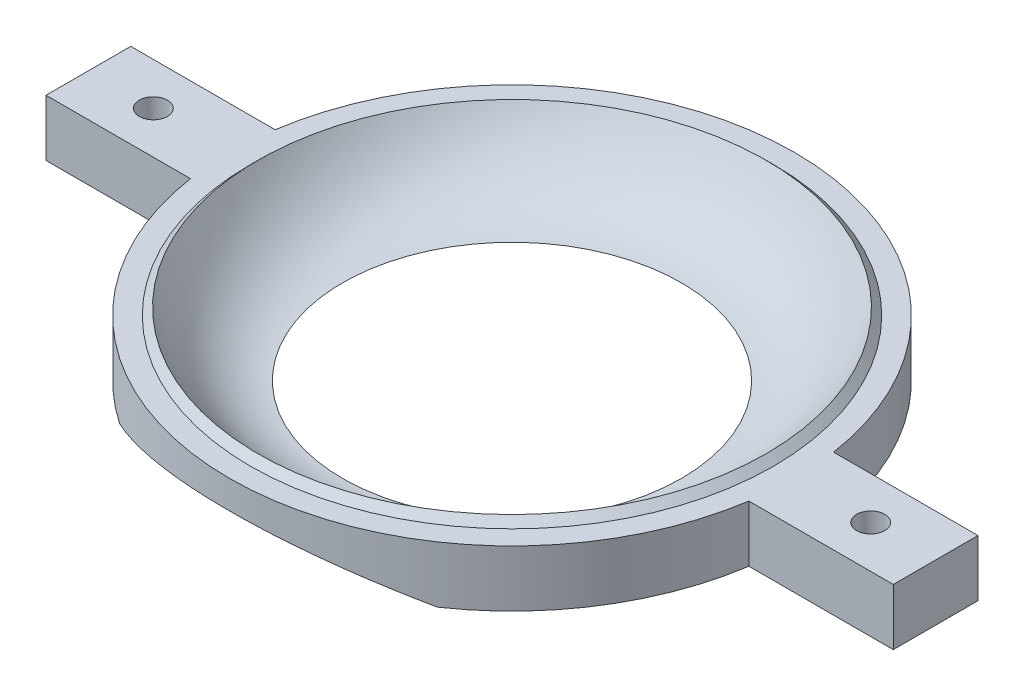
ISO-10303-21;
HEADER;
FILE_DESCRIPTION(('STEP AP214'),'2;1');
FILE_NAME('part.step','',(''),(''),'','','');
FILE_SCHEMA(('AUTOMOTIVE_DESIGN { 1 0 10303 214 1 1 1 1 }'));
ENDSEC;
DATA;
#1=APPLICATION_CONTEXT('core data for automotive mechanical design processes');
#2=APPLICATION_PROTOCOL_DEFINITION('international standard','automotive_design',2000,#1);
#3=PRODUCT_CONTEXT('',#1,'mechanical');
#4=PRODUCT('Part','Part','',(#3));
#5=PRODUCT_RELATED_PRODUCT_CATEGORY('part','',(#4));
#6=PRODUCT_DEFINITION_FORMATION('','',#4);
#7=PRODUCT_DEFINITION_CONTEXT('part definition',#1,'design');
#8=PRODUCT_DEFINITION('design','',#6,#7);
#9=PRODUCT_DEFINITION_SHAPE('','',#8);
#10=(LENGTH_UNIT() NAMED_UNIT(*) SI_UNIT(.MILLI.,.METRE.));
#11=(NAMED_UNIT(*) PLANE_ANGLE_UNIT() SI_UNIT($,.RADIAN.));
#12=(NAMED_UNIT(*) SI_UNIT($,.STERADIAN.) SOLID_ANGLE_UNIT());
#13=UNCERTAINTY_MEASURE_WITH_UNIT(LENGTH_MEASURE(1.E-05),#10,'distance_accuracy_value','');
#14=(GEOMETRIC_REPRESENTATION_CONTEXT(3) GLOBAL_UNCERTAINTY_ASSIGNED_CONTEXT((#13)) GLOBAL_UNIT_ASSIGNED_CONTEXT((#10,
#11,#12)) REPRESENTATION_CONTEXT('',''));
#15=CARTESIAN_POINT('',(0.,0.,0.));
#16=DIRECTION('',(0.,0.,1.));
#17=DIRECTION('',(1.,0.,0.));
#18=AXIS2_PLACEMENT_3D('',#15,#16,#17);
#19=CARTESIAN_POINT('',(0.,1.,0.));
#20=DIRECTION('',(0.,-1.,0.));
#21=DIRECTION('',(0.,0.,-1.));
#22=AXIS2_PLACEMENT_3D('',#19,#20,#21);
#23=CYLINDRICAL_SURFACE('',#22,10.);
#24=CARTESIAN_POINT('',(0.,-1.,0.));
#25=DIRECTION('',(0.,1.,0.));
#26=DIRECTION('',(0.,0.,1.));
#27=AXIS2_PLACEMENT_3D('',#24,#25,#26);
#28=CIRCLE('',#27,10.);
#29=CARTESIAN_POINT('',(-9.88685996664258,-1.,1.50000000000011));
#30=VERTEX_POINT('',#29);
#31=CARTESIAN_POINT('',(-5.62503476890386,-1.,8.26794919243114));
#32=VERTEX_POINT('',#31);
#33=EDGE_CURVE('E118',#30,#32,#28,.T.);
#34=ORIENTED_EDGE('',*,*,#33,.T.);
#35=CARTESIAN_POINT('',(0.,-5.7735026918963,0.));
#36=DIRECTION('',(0.,0.866025403784437,-0.500000000000003));
#37=DIRECTION('',(0.,-0.500000000000003,-0.866025403784437));
#38=AXIS2_PLACEMENT_3D('',#35,#36,#37);
#39=ELLIPSE('',#38,11.5470053837925,10.);
#40=CARTESIAN_POINT('',(5.62503476890386,-1.,8.26794919243114));
#41=VERTEX_POINT('',#40);
#42=EDGE_CURVE('E57',#32,#41,#39,.T.);
#43=ORIENTED_EDGE('',*,*,#42,.T.);
#44=CARTESIAN_POINT('',(9.88685996664258,-1.,1.50000000000011));
#45=VERTEX_POINT('',#44);
#46=EDGE_CURVE('E114',#41,#45,#28,.T.);
#47=ORIENTED_EDGE('',*,*,#46,.T.);
#48=DIRECTION('',(0.,-1.,0.));
#49=VECTOR('',#48,1.);
#50=CARTESIAN_POINT('',(9.88685996664258,1.,1.50000000000011));
#51=LINE('',#50,#49);
#52=CARTESIAN_POINT('',(9.88685996664258,1.,1.50000000000011));
#53=VERTEX_POINT('',#52);
#54=EDGE_CURVE('E122',#53,#45,#51,.T.);
#55=ORIENTED_EDGE('',*,*,#54,.F.);
#56=CARTESIAN_POINT('',(0.,1.,0.));
#57=DIRECTION('',(0.,1.,0.));
#58=DIRECTION('',(0.,0.,1.));
#59=AXIS2_PLACEMENT_3D('',#56,#57,#58);
#60=CIRCLE('',#59,10.);
#61=CARTESIAN_POINT('',(-9.88685996664258,1.,1.50000000000011));
#62=VERTEX_POINT('',#61);
#63=EDGE_CURVE('E163',#62,#53,#60,.T.);
#64=ORIENTED_EDGE('',*,*,#63,.F.);
#65=DIRECTION('',(0.,-1.,0.));
#66=VECTOR('',#65,1.);
#67=CARTESIAN_POINT('',(-9.88685996664258,1.,1.50000000000011));
#68=LINE('',#67,#66);
#69=EDGE_CURVE('E164',#62,#30,#68,.T.);
#70=ORIENTED_EDGE('',*,*,#69,.T.);
#71=EDGE_LOOP('',(#34,#43,#47,#55,#64,#70));
#72=FACE_BOUND('',#71,.T.);
#73=ADVANCED_FACE('F38',(#72),#23,.T.);
#74=CARTESIAN_POINT('',(0.,1.,1.50000000000011));
#75=DIRECTION('',(0.,0.,-1.));
#76=DIRECTION('',(-1.,0.,0.));
#77=AXIS2_PLACEMENT_3D('',#74,#75,#76);
#78=PLANE('',#77);
#79=DIRECTION('',(1.,0.,0.));
#80=VECTOR('',#79,1.);
#81=CARTESIAN_POINT('',(0.,-1.,1.50000000000011));
#82=LINE('',#81,#80);
#83=CARTESIAN_POINT('',(14.9999999999999,-1.,1.50000000000011));
#84=VERTEX_POINT('',#83);
#85=EDGE_CURVE('E127',#45,#84,#82,.T.);
#86=ORIENTED_EDGE('',*,*,#85,.T.);
#87=DIRECTION('',(0.,-1.,0.));
#88=VECTOR('',#87,1.);
#89=CARTESIAN_POINT('',(14.9999999999999,1.,1.50000000000011));
#90=LINE('',#89,#88);
#91=CARTESIAN_POINT('',(14.9999999999999,1.,1.50000000000011));
#92=VERTEX_POINT('',#91);
#93=EDGE_CURVE('E177',#92,#84,#90,.T.);
#94=ORIENTED_EDGE('',*,*,#93,.F.);
#95=DIRECTION('',(1.,0.,0.));
#96=VECTOR('',#95,1.);
#97=CARTESIAN_POINT('',(0.,1.,1.50000000000011));
#98=LINE('',#97,#96);
#99=EDGE_CURVE('E183',#53,#92,#98,.T.);
#100=ORIENTED_EDGE('',*,*,#99,.F.);
#101=ORIENTED_EDGE('',*,*,#54,.T.);
#102=EDGE_LOOP('',(#86,#94,#100,#101));
#103=FACE_BOUND('',#102,.T.);
#104=ADVANCED_FACE('F181',(#103),#78,.F.);
#105=CARTESIAN_POINT('',(15.,1.,3.2959746043558E-13));
#106=DIRECTION('',(-1.,0.,0.));
#107=DIRECTION('',(0.,0.,1.));
#108=AXIS2_PLACEMENT_3D('',#105,#106,#107);
#109=PLANE('',#108);
#110=DIRECTION('',(0.,0.,-1.));
#111=VECTOR('',#110,1.);
#112=CARTESIAN_POINT('',(15.,-1.,3.2959746043558E-13));
#113=LINE('',#112,#111);
#114=CARTESIAN_POINT('',(15.,-1.,-1.5));
#115=VERTEX_POINT('',#114);
#116=EDGE_CURVE('E139',#84,#115,#113,.T.);
#117=ORIENTED_EDGE('',*,*,#116,.T.);
#118=DIRECTION('',(0.,-1.,0.));
#119=VECTOR('',#118,1.);
#120=CARTESIAN_POINT('',(15.,1.,-1.5));
#121=LINE('',#120,#119);
#122=CARTESIAN_POINT('',(15.,1.,-1.5));
#123=VERTEX_POINT('',#122);
#124=EDGE_CURVE('E175',#123,#115,#121,.T.);
#125=ORIENTED_EDGE('',*,*,#124,.F.);
#126=DIRECTION('',(0.,0.,-1.));
#127=VECTOR('',#126,1.);
#128=CARTESIAN_POINT('',(15.,1.,3.2959746043558E-13));
#129=LINE('',#128,#127);
#130=EDGE_CURVE('E189',#92,#123,#129,.T.);
#131=ORIENTED_EDGE('',*,*,#130,.F.);
#132=ORIENTED_EDGE('',*,*,#93,.T.);
#133=EDGE_LOOP('',(#117,#125,#131,#132));
#134=FACE_BOUND('',#133,.T.);
#135=ADVANCED_FACE('F270',(#134),#109,.F.);
#136=CARTESIAN_POINT('',(0.,1.,-1.5));
#137=DIRECTION('',(0.,0.,-1.));
#138=DIRECTION('',(-1.,0.,0.));
#139=AXIS2_PLACEMENT_3D('',#136,#137,#138);
#140=PLANE('',#139);
#141=DIRECTION('',(1.,0.,0.));
#142=VECTOR('',#141,1.);
#143=CARTESIAN_POINT('',(0.,-1.,-1.5));
#144=LINE('',#143,#142);
#145=CARTESIAN_POINT('',(9.88685996664259,-1.,-1.5));
#146=VERTEX_POINT('',#145);
#147=EDGE_CURVE('E142',#146,#115,#144,.T.);
#148=ORIENTED_EDGE('',*,*,#147,.F.);
#149=DIRECTION('',(0.,-1.,0.));
#150=VECTOR('',#149,1.);
#151=CARTESIAN_POINT('',(9.88685996664259,1.,-1.5));
#152=LINE('',#151,#150);
#153=CARTESIAN_POINT('',(9.88685996664259,1.,-1.5));
#154=VERTEX_POINT('',#153);
#155=EDGE_CURVE('E173',#154,#146,#152,.T.);
#156=ORIENTED_EDGE('',*,*,#155,.F.);
#157=DIRECTION('',(1.,0.,0.));
#158=VECTOR('',#157,1.);
#159=CARTESIAN_POINT('',(0.,1.,-1.5));
#160=LINE('',#159,#158);
#161=EDGE_CURVE('E194',#154,#123,#160,.T.);
#162=ORIENTED_EDGE('',*,*,#161,.T.);
#163=ORIENTED_EDGE('',*,*,#124,.T.);
#164=EDGE_LOOP('',(#148,#156,#162,#163));
#165=FACE_BOUND('',#164,.T.);
#166=ADVANCED_FACE('F266',(#165),#140,.T.);
#167=CARTESIAN_POINT('',(0.,1.,0.));
#168=DIRECTION('',(0.,-1.,0.));
#169=DIRECTION('',(0.,0.,-1.));
#170=AXIS2_PLACEMENT_3D('',#167,#168,#169);
#171=CYLINDRICAL_SURFACE('',#170,10.);
#172=CARTESIAN_POINT('',(0.,-1.,0.));
#173=DIRECTION('',(0.,1.,0.));
#174=DIRECTION('',(0.,0.,1.));
#175=AXIS2_PLACEMENT_3D('',#172,#173,#174);
#176=CIRCLE('',#175,10.);
#177=CARTESIAN_POINT('',(5.62503476890386,-1.,-8.26794919243114));
#178=VERTEX_POINT('',#177);
#179=EDGE_CURVE('E146',#146,#178,#176,.T.);
#180=ORIENTED_EDGE('',*,*,#179,.T.);
#181=CARTESIAN_POINT('',(0.,-5.77350269189632,0.));
#182=DIRECTION('',(0.,0.866025403784436,0.500000000000004));
#183=DIRECTION('',(0.,-0.500000000000004,0.866025403784436));
#184=AXIS2_PLACEMENT_3D('',#181,#182,#183);
#185=ELLIPSE('',#184,11.5470053837925,10.);
#186=CARTESIAN_POINT('',(-5.62503476890385,-0.999999999999998,-8.26794919243114));
#187=VERTEX_POINT('',#186);
#188=EDGE_CURVE('E51',#178,#187,#185,.T.);
#189=ORIENTED_EDGE('',*,*,#188,.T.);
#190=CARTESIAN_POINT('',(-9.88685996664259,-1.,-1.5));
#191=VERTEX_POINT('',#190);
#192=EDGE_CURVE('E145',#187,#191,#176,.T.);
#193=ORIENTED_EDGE('',*,*,#192,.T.);
#194=DIRECTION('',(0.,-1.,0.));
#195=VECTOR('',#194,1.);
#196=CARTESIAN_POINT('',(-9.88685996664259,1.,-1.5));
#197=LINE('',#196,#195);
#198=CARTESIAN_POINT('',(-9.88685996664259,1.,-1.5));
#199=VERTEX_POINT('',#198);
#200=EDGE_CURVE('E170',#199,#191,#197,.T.);
#201=ORIENTED_EDGE('',*,*,#200,.F.);
#202=CARTESIAN_POINT('',(0.,1.,0.));
#203=DIRECTION('',(0.,1.,0.));
#204=DIRECTION('',(0.,0.,1.));
#205=AXIS2_PLACEMENT_3D('',#202,#203,#204);
#206=CIRCLE('',#205,10.);
#207=EDGE_CURVE('E197',#154,#199,#206,.T.);
#208=ORIENTED_EDGE('',*,*,#207,.F.);
#209=ORIENTED_EDGE('',*,*,#155,.T.);
#210=EDGE_LOOP('',(#180,#189,#193,#201,#208,#209));
#211=FACE_BOUND('',#210,.T.);
#212=ADVANCED_FACE('F262',(#211),#171,.T.);
#213=CARTESIAN_POINT('',(0.,1.,-1.5));
#214=DIRECTION('',(0.,0.,-1.));
#215=DIRECTION('',(-1.,0.,0.));
#216=AXIS2_PLACEMENT_3D('',#213,#214,#215);
#217=PLANE('',#216);
#218=DIRECTION('',(1.,0.,0.));
#219=VECTOR('',#218,1.);
#220=CARTESIAN_POINT('',(0.,-1.,-1.5));
#221=LINE('',#220,#219);
#222=CARTESIAN_POINT('',(-15.,-1.,-1.5));
#223=VERTEX_POINT('',#222);
#224=EDGE_CURVE('E149',#223,#191,#221,.T.);
#225=ORIENTED_EDGE('',*,*,#224,.F.);
#226=DIRECTION('',(0.,-1.,0.));
#227=VECTOR('',#226,1.);
#228=CARTESIAN_POINT('',(-15.,1.,-1.5));
#229=LINE('',#228,#227);
#230=CARTESIAN_POINT('',(-15.,1.,-1.5));
#231=VERTEX_POINT('',#230);
#232=EDGE_CURVE('E168',#231,#223,#229,.T.);
#233=ORIENTED_EDGE('',*,*,#232,.F.);
#234=DIRECTION('',(1.,0.,0.));
#235=VECTOR('',#234,1.);
#236=CARTESIAN_POINT('',(0.,1.,-1.5));
#237=LINE('',#236,#235);
#238=EDGE_CURVE('E199',#231,#199,#237,.T.);
#239=ORIENTED_EDGE('',*,*,#238,.T.);
#240=ORIENTED_EDGE('',*,*,#200,.T.);
#241=EDGE_LOOP('',(#225,#233,#239,#240));
#242=FACE_BOUND('',#241,.T.);
#243=ADVANCED_FACE('F258',(#242),#217,.T.);
#244=CARTESIAN_POINT('',(-15.,1.,3.2959746043558E-13));
#245=DIRECTION('',(-1.,0.,0.));
#246=DIRECTION('',(0.,0.,1.));
#247=AXIS2_PLACEMENT_3D('',#244,#245,#246);
#248=PLANE('',#247);
#249=DIRECTION('',(0.,0.,-1.));
#250=VECTOR('',#249,1.);
#251=CARTESIAN_POINT('',(-15.,-1.,3.2959746043558E-13));
#252=LINE('',#251,#250);
#253=CARTESIAN_POINT('',(-14.9999999999999,-1.,1.50000000000011));
#254=VERTEX_POINT('',#253);
#255=EDGE_CURVE('E152',#254,#223,#252,.T.);
#256=ORIENTED_EDGE('',*,*,#255,.F.);
#257=DIRECTION('',(0.,-1.,0.));
#258=VECTOR('',#257,1.);
#259=CARTESIAN_POINT('',(-14.9999999999999,1.,1.50000000000011));
#260=LINE('',#259,#258);
#261=CARTESIAN_POINT('',(-14.9999999999999,1.,1.50000000000011));
#262=VERTEX_POINT('',#261);
#263=EDGE_CURVE('E166',#262,#254,#260,.T.);
#264=ORIENTED_EDGE('',*,*,#263,.F.);
#265=DIRECTION('',(0.,0.,-1.));
#266=VECTOR('',#265,1.);
#267=CARTESIAN_POINT('',(-15.,1.,3.2959746043558E-13));
#268=LINE('',#267,#266);
#269=EDGE_CURVE('E202',#262,#231,#268,.T.);
#270=ORIENTED_EDGE('',*,*,#269,.T.);
#271=ORIENTED_EDGE('',*,*,#232,.T.);
#272=EDGE_LOOP('',(#256,#264,#270,#271));
#273=FACE_BOUND('',#272,.T.);
#274=ADVANCED_FACE('F252',(#273),#248,.T.);
#275=CARTESIAN_POINT('',(-12.7,1.,0.));
#276=DIRECTION('',(0.,-1.,0.));
#277=DIRECTION('',(0.,0.,-1.));
#278=AXIS2_PLACEMENT_3D('',#275,#276,#277);
#279=CYLINDRICAL_SURFACE('',#278,0.500000000000001);
#280=CARTESIAN_POINT('',(-12.7,1.,0.));
#281=DIRECTION('',(0.,1.,0.));
#282=DIRECTION('',(0.,0.,1.));
#283=AXIS2_PLACEMENT_3D('',#280,#281,#282);
#284=CIRCLE('',#283,0.500000000000001);
#285=CARTESIAN_POINT('',(-12.7,1.,0.500000000000001));
#286=VERTEX_POINT('',#285);
#287=EDGE_CURVE('E206',#286,#286,#284,.T.);
#288=ORIENTED_EDGE('',*,*,#287,.T.);
#289=EDGE_LOOP('',(#288));
#290=FACE_BOUND('',#289,.T.);
#291=CARTESIAN_POINT('',(-12.7,-1.,0.));
#292=DIRECTION('',(0.,1.,0.));
#293=DIRECTION('',(0.,0.,1.));
#294=AXIS2_PLACEMENT_3D('',#291,#292,#293);
#295=CIRCLE('',#294,0.500000000000001);
#296=CARTESIAN_POINT('',(-12.7,-1.,0.500000000000001));
#297=VERTEX_POINT('',#296);
#298=EDGE_CURVE('E157',#297,#297,#295,.T.);
#299=ORIENTED_EDGE('',*,*,#298,.F.);
#300=EDGE_LOOP('',(#299));
#301=FACE_BOUND('',#300,.T.);
#302=ADVANCED_FACE('F249',(#290,#301),#279,.F.);
#303=CARTESIAN_POINT('',(0.,1.,1.50000000000011));
#304=DIRECTION('',(0.,0.,-1.));
#305=DIRECTION('',(-1.,0.,0.));
#306=AXIS2_PLACEMENT_3D('',#303,#304,#305);
#307=PLANE('',#306);
#308=DIRECTION('',(1.,0.,0.));
#309=VECTOR('',#308,1.);
#310=CARTESIAN_POINT('',(0.,-1.,1.50000000000011));
#311=LINE('',#310,#309);
#312=EDGE_CURVE('E155',#254,#30,#311,.T.);
#313=ORIENTED_EDGE('',*,*,#312,.T.);
#314=ORIENTED_EDGE('',*,*,#69,.F.);
#315=DIRECTION('',(1.,0.,0.));
#316=VECTOR('',#315,1.);
#317=CARTESIAN_POINT('',(0.,1.,1.50000000000011));
#318=LINE('',#317,#316);
#319=EDGE_CURVE('E205',#262,#62,#318,.T.);
#320=ORIENTED_EDGE('',*,*,#319,.F.);
#321=ORIENTED_EDGE('',*,*,#263,.T.);
#322=EDGE_LOOP('',(#313,#314,#320,#321));
#323=FACE_BOUND('',#322,.T.);
#324=ADVANCED_FACE('F218',(#323),#307,.F.);
#325=CARTESIAN_POINT('',(12.7,1.,0.));
#326=DIRECTION('',(0.,-1.,0.));
#327=DIRECTION('',(0.,0.,-1.));
#328=AXIS2_PLACEMENT_3D('',#325,#326,#327);
#329=CYLINDRICAL_SURFACE('',#328,0.500000000000001);
#330=CARTESIAN_POINT('',(12.7,1.,0.));
#331=DIRECTION('',(0.,1.,0.));
#332=DIRECTION('',(0.,0.,1.));
#333=AXIS2_PLACEMENT_3D('',#330,#331,#332);
#334=CIRCLE('',#333,0.500000000000001);
#335=CARTESIAN_POINT('',(12.7,1.,0.500000000000001));
#336=VERTEX_POINT('',#335);
#337=EDGE_CURVE('E136',#336,#336,#334,.F.);
#338=ORIENTED_EDGE('',*,*,#337,.F.);
#339=EDGE_LOOP('',(#338));
#340=FACE_BOUND('',#339,.T.);
#341=CARTESIAN_POINT('',(12.7,-1.,0.));
#342=DIRECTION('',(0.,1.,0.));
#343=DIRECTION('',(0.,0.,1.));
#344=AXIS2_PLACEMENT_3D('',#341,#342,#343);
#345=CIRCLE('',#344,0.500000000000001);
#346=CARTESIAN_POINT('',(12.7,-1.,0.500000000000001));
#347=VERTEX_POINT('',#346);
#348=EDGE_CURVE('E160',#347,#347,#345,.F.);
#349=ORIENTED_EDGE('',*,*,#348,.T.);
#350=EDGE_LOOP('',(#349));
#351=FACE_BOUND('',#350,.T.);
#352=ADVANCED_FACE('F215',(#340,#351),#329,.F.);
#353=CARTESIAN_POINT('',(0.,1.,0.));
#354=DIRECTION('',(0.,1.,0.));
#355=DIRECTION('',(0.,0.,1.));
#356=AXIS2_PLACEMENT_3D('',#353,#354,#355);
#357=PLANE('',#356);
#358=CARTESIAN_POINT('',(0.,1.00000000000011,0.));
#359=DIRECTION('',(0.,-1.,0.));
#360=DIRECTION('',(1.,0.,0.));
#361=AXIS2_PLACEMENT_3D('',#358,#359,#360);
#362=CIRCLE('',#361,9.25684970824005);
#363=CARTESIAN_POINT('',(9.25684970824004,1.00000000000014,0.));
#364=VERTEX_POINT('',#363);
#365=EDGE_CURVE('E132',#364,#364,#362,.T.);
#366=ORIENTED_EDGE('',*,*,#365,.T.);
#367=EDGE_LOOP('',(#366));
#368=FACE_BOUND('',#367,.T.);
#369=ORIENTED_EDGE('',*,*,#63,.T.);
#370=ORIENTED_EDGE('',*,*,#99,.T.);
#371=ORIENTED_EDGE('',*,*,#130,.T.);
#372=ORIENTED_EDGE('',*,*,#161,.F.);
#373=ORIENTED_EDGE('',*,*,#207,.T.);
#374=ORIENTED_EDGE('',*,*,#238,.F.);
#375=ORIENTED_EDGE('',*,*,#269,.F.);
#376=ORIENTED_EDGE('',*,*,#319,.T.);
#377=EDGE_LOOP('',(#369,#370,#371,#372,#373,#374,#375,#376));
#378=FACE_BOUND('',#377,.T.);
#379=ORIENTED_EDGE('',*,*,#287,.F.);
#380=EDGE_LOOP('',(#379));
#381=FACE_BOUND('',#380,.T.);
#382=ORIENTED_EDGE('',*,*,#337,.T.);
#383=EDGE_LOOP('',(#382));
#384=FACE_BOUND('',#383,.T.);
#385=ADVANCED_FACE('F213',(#368,#378,#381,#384),#357,.T.);
#386=CARTESIAN_POINT('',(0.,-1.,0.));
#387=DIRECTION('',(0.,1.,0.));
#388=DIRECTION('',(0.,0.,1.));
#389=AXIS2_PLACEMENT_3D('',#386,#387,#388);
#390=PLANE('',#389);
#391=ORIENTED_EDGE('',*,*,#192,.F.);
#392=DIRECTION('',(1.,0.,0.));
#393=VECTOR('',#392,1.);
#394=CARTESIAN_POINT('',(0.,-1.,-8.26794919243114));
#395=LINE('',#394,#393);
#396=EDGE_CURVE('E11',#187,#178,#395,.T.);
#397=ORIENTED_EDGE('',*,*,#396,.T.);
#398=ORIENTED_EDGE('',*,*,#179,.F.);
#399=ORIENTED_EDGE('',*,*,#147,.T.);
#400=ORIENTED_EDGE('',*,*,#116,.F.);
#401=ORIENTED_EDGE('',*,*,#85,.F.);
#402=ORIENTED_EDGE('',*,*,#46,.F.);
#403=DIRECTION('',(-1.,0.,0.));
#404=VECTOR('',#403,1.);
#405=CARTESIAN_POINT('',(0.,-1.,8.26794919243114));
#406=LINE('',#405,#404);
#407=EDGE_CURVE('E45',#41,#32,#406,.T.);
#408=ORIENTED_EDGE('',*,*,#407,.T.);
#409=ORIENTED_EDGE('',*,*,#33,.F.);
#410=ORIENTED_EDGE('',*,*,#312,.F.);
#411=ORIENTED_EDGE('',*,*,#255,.T.);
#412=ORIENTED_EDGE('',*,*,#224,.T.);
#413=EDGE_LOOP('',(#391,#397,#398,#399,#400,#401,#402,#408,#409,#410,#411,#412));
#414=FACE_BOUND('',#413,.T.);
#415=ORIENTED_EDGE('',*,*,#298,.T.);
#416=EDGE_LOOP('',(#415));
#417=FACE_BOUND('',#416,.T.);
#418=ORIENTED_EDGE('',*,*,#348,.F.);
#419=EDGE_LOOP('',(#418));
#420=FACE_BOUND('',#419,.T.);
#421=CARTESIAN_POINT('',(0.,-1.,0.));
#422=DIRECTION('',(0.,-1.,0.));
#423=DIRECTION('',(1.,0.,0.));
#424=AXIS2_PLACEMENT_3D('',#421,#422,#423);
#425=CIRCLE('',#424,6.);
#426=CARTESIAN_POINT('',(6.00000000000001,-0.99999999999998,0.));
#427=VERTEX_POINT('',#426);
#428=EDGE_CURVE('E228',#427,#427,#425,.T.);
#429=ORIENTED_EDGE('',*,*,#428,.F.);
#430=EDGE_LOOP('',(#429));
#431=FACE_BOUND('',#430,.T.);
#432=ADVANCED_FACE('F124',(#414,#417,#420,#431),#390,.F.);
#433=CARTESIAN_POINT('',(-9.,1.25684970824005,0.));
#434=CARTESIAN_POINT('',(-7.84507399160497,-0.898418356584243,0.));
#435=CARTESIAN_POINT('',(-5.9301399140341,-1.0045736276298,0.));
#436=B_SPLINE_CURVE_WITH_KNOTS('',2,(#433,#434,#435),.UNSPECIFIED.,.F.,.F.,(3,3),(0.,1.),.UNSPECIFIED.);
#437=CARTESIAN_POINT('',(3.49148133884313E-12,-1000.,0.));
#438=DIRECTION('',(0.,-1.,0.));
#439=AXIS1_PLACEMENT('',#437,#438);
#440=SURFACE_OF_REVOLUTION('',#436,#439);
#441=ORIENTED_EDGE('',*,*,#428,.T.);
#442=EDGE_LOOP('',(#441));
#443=FACE_BOUND('',#442,.T.);
#444=CARTESIAN_POINT('',(0.,1.25684970824014,0.));
#445=DIRECTION('',(0.,-1.,0.));
#446=DIRECTION('',(1.,0.,0.));
#447=AXIS2_PLACEMENT_3D('',#444,#445,#446);
#448=CIRCLE('',#447,9.);
#449=CARTESIAN_POINT('',(8.99999999999999,1.25684970824017,0.));
#450=VERTEX_POINT('',#449);
#451=EDGE_CURVE('E129',#450,#450,#448,.T.);
#452=ORIENTED_EDGE('',*,*,#451,.F.);
#453=EDGE_LOOP('',(#452));
#454=FACE_BOUND('',#453,.T.);
#455=ADVANCED_FACE('F224',(#443,#454),#440,.F.);
#456=CARTESIAN_POINT('',(0.,1.00000000000011,0.));
#457=DIRECTION('',(0.,-1.,0.));
#458=DIRECTION('',(1.,0.,0.));
#459=AXIS2_PLACEMENT_3D('',#456,#457,#458);
#460=CONICAL_SURFACE('',#459,9.25684970824005,0.785398163397499);
#461=ORIENTED_EDGE('',*,*,#451,.T.);
#462=EDGE_LOOP('',(#461));
#463=FACE_BOUND('',#462,.T.);
#464=ORIENTED_EDGE('',*,*,#365,.F.);
#465=EDGE_LOOP('',(#464));
#466=FACE_BOUND('',#465,.T.);
#467=ADVANCED_FACE('F244',(#463,#466),#460,.T.);
#468=CARTESIAN_POINT('',(17.0000000000004,-4.08012701892206,2.9330127018925));
#469=DIRECTION('',(0.,0.866025403784437,-0.500000000000003));
#470=DIRECTION('',(0.,0.500000000000003,0.866025403784437));
#471=AXIS2_PLACEMENT_3D('',#468,#469,#470);
#472=PLANE('',#471);
#473=ORIENTED_EDGE('',*,*,#407,.F.);
#474=ORIENTED_EDGE('',*,*,#42,.F.);
#475=EDGE_LOOP('',(#473,#474));
#476=FACE_BOUND('',#475,.T.);
#477=ADVANCED_FACE('F120',(#476),#472,.F.);
#478=CARTESIAN_POINT('',(17.0000000000003,-4.08012701892236,-2.93301270189202));
#479=DIRECTION('',(0.,0.866025403784436,0.500000000000004));
#480=DIRECTION('',(0.,-0.500000000000004,0.866025403784436));
#481=AXIS2_PLACEMENT_3D('',#478,#479,#480);
#482=PLANE('',#481);
#483=ORIENTED_EDGE('',*,*,#396,.F.);
#484=ORIENTED_EDGE('',*,*,#188,.F.);
#485=EDGE_LOOP('',(#483,#484));
#486=FACE_BOUND('',#485,.T.);
#487=ADVANCED_FACE('F311',(#486),#482,.F.);
#488=CLOSED_SHELL('',(#73,#104,#135,#166,#212,#243,#274,#302,#324,#352,#385,#432,#455,#467,#477,#487));
#489=MANIFOLD_SOLID_BREP('B2',#488);
#490=ADVANCED_BREP_SHAPE_REPRESENTATION('',(#18,#489),#14);
#491=SHAPE_DEFINITION_REPRESENTATION(#9,#490);
ENDSEC;
END-ISO-10303-21;
